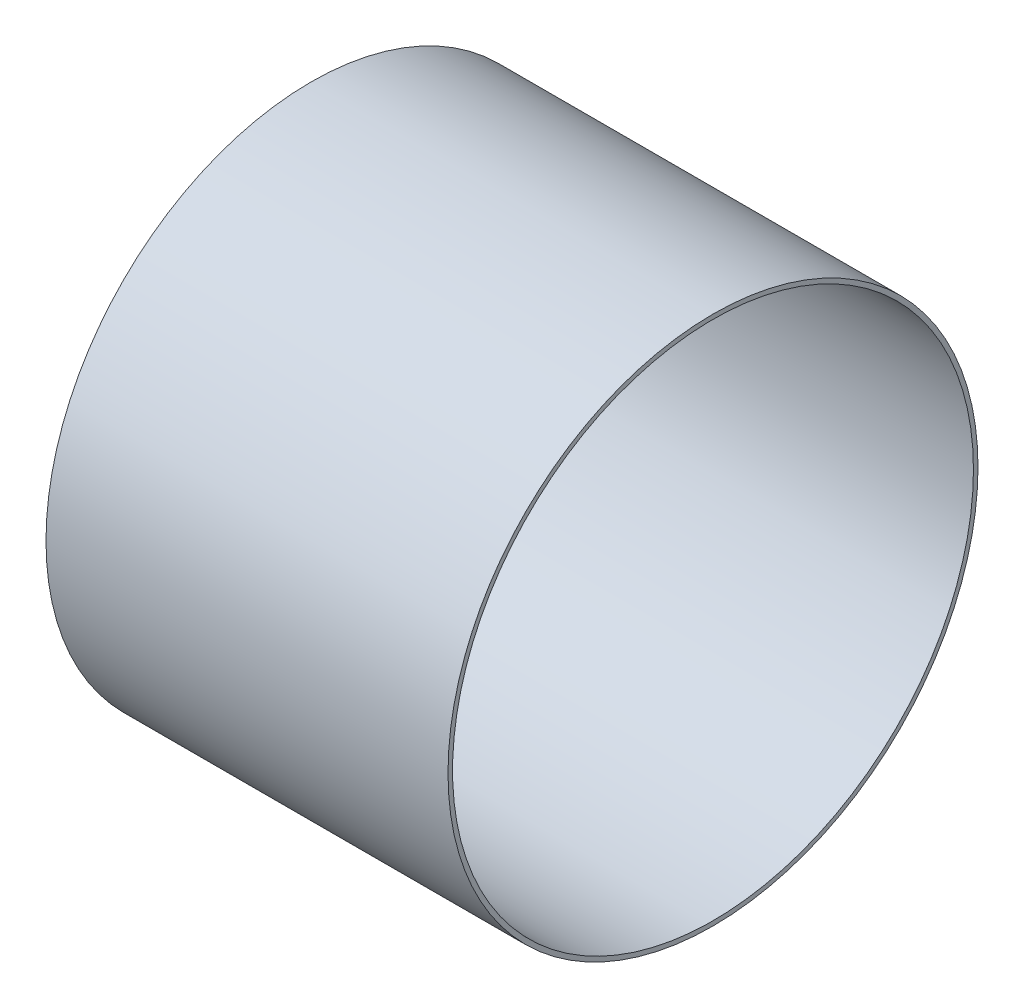
ISO-10303-21;
HEADER;
FILE_DESCRIPTION(('STEP AP214'),'2;1');
FILE_NAME('part.step','',(''),(''),'','','');
FILE_SCHEMA(('AUTOMOTIVE_DESIGN { 1 0 10303 214 1 1 1 1 }'));
ENDSEC;
DATA;
#1=APPLICATION_CONTEXT('core data for automotive mechanical design processes');
#2=APPLICATION_PROTOCOL_DEFINITION('international standard','automotive_design',2000,#1);
#3=PRODUCT_CONTEXT('',#1,'mechanical');
#4=PRODUCT('Part','Part','',(#3));
#5=PRODUCT_RELATED_PRODUCT_CATEGORY('part','',(#4));
#6=PRODUCT_DEFINITION_FORMATION('','',#4);
#7=PRODUCT_DEFINITION_CONTEXT('part definition',#1,'design');
#8=PRODUCT_DEFINITION('design','',#6,#7);
#9=PRODUCT_DEFINITION_SHAPE('','',#8);
#10=(LENGTH_UNIT() NAMED_UNIT(*) SI_UNIT(.MILLI.,.METRE.));
#11=(NAMED_UNIT(*) PLANE_ANGLE_UNIT() SI_UNIT($,.RADIAN.));
#12=(NAMED_UNIT(*) SI_UNIT($,.STERADIAN.) SOLID_ANGLE_UNIT());
#13=UNCERTAINTY_MEASURE_WITH_UNIT(LENGTH_MEASURE(1.E-05),#10,'distance_accuracy_value','');
#14=(GEOMETRIC_REPRESENTATION_CONTEXT(3) GLOBAL_UNCERTAINTY_ASSIGNED_CONTEXT((#13)) GLOBAL_UNIT_ASSIGNED_CONTEXT((#10,
#11,#12)) REPRESENTATION_CONTEXT('',''));
#15=CARTESIAN_POINT('',(0.,0.,0.));
#16=DIRECTION('',(0.,0.,1.));
#17=DIRECTION('',(1.,0.,0.));
#18=AXIS2_PLACEMENT_3D('',#15,#16,#17);
#19=CARTESIAN_POINT('',(74.09688,0.,0.));
#20=DIRECTION('',(1.,0.,0.));
#21=DIRECTION('',(0.,0.,-1.));
#22=AXIS2_PLACEMENT_3D('',#19,#20,#21);
#23=PLANE('',#22);
#24=CARTESIAN_POINT('',(74.09688,0.,0.));
#25=DIRECTION('',(1.,0.,0.));
#26=DIRECTION('',(0.,0.,-1.));
#27=AXIS2_PLACEMENT_3D('',#24,#25,#26);
#28=CIRCLE('',#27,48.8442);
#29=CARTESIAN_POINT('',(74.09688,0.,-48.8442));
#30=VERTEX_POINT('',#29);
#31=EDGE_CURVE('E10',#30,#30,#28,.T.);
#32=ORIENTED_EDGE('',*,*,#31,.T.);
#33=EDGE_LOOP('',(#32));
#34=FACE_BOUND('',#33,.T.);
#35=CARTESIAN_POINT('',(74.09688,0.,0.));
#36=DIRECTION('',(1.,0.,0.));
#37=DIRECTION('',(0.,0.,-1.));
#38=AXIS2_PLACEMENT_3D('',#35,#36,#37);
#39=CIRCLE('',#38,48.006);
#40=CARTESIAN_POINT('',(74.09688,0.,-48.006));
#41=VERTEX_POINT('',#40);
#42=EDGE_CURVE('E46',#41,#41,#39,.T.);
#43=ORIENTED_EDGE('',*,*,#42,.F.);
#44=EDGE_LOOP('',(#43));
#45=FACE_BOUND('',#44,.T.);
#46=ADVANCED_FACE('F35',(#34,#45),#23,.T.);
#47=CARTESIAN_POINT('',(0.,0.,0.));
#48=DIRECTION('',(1.,0.,0.));
#49=DIRECTION('',(0.,0.,-1.));
#50=AXIS2_PLACEMENT_3D('',#47,#48,#49);
#51=PLANE('',#50);
#52=CARTESIAN_POINT('',(0.,0.,0.));
#53=DIRECTION('',(1.,0.,0.));
#54=DIRECTION('',(0.,0.,-1.));
#55=AXIS2_PLACEMENT_3D('',#52,#53,#54);
#56=CIRCLE('',#55,48.8442);
#57=CARTESIAN_POINT('',(0.,0.,-48.8442));
#58=VERTEX_POINT('',#57);
#59=EDGE_CURVE('E39',#58,#58,#56,.T.);
#60=ORIENTED_EDGE('',*,*,#59,.F.);
#61=EDGE_LOOP('',(#60));
#62=FACE_BOUND('',#61,.T.);
#63=CARTESIAN_POINT('',(0.,0.,0.));
#64=DIRECTION('',(1.,0.,0.));
#65=DIRECTION('',(0.,0.,-1.));
#66=AXIS2_PLACEMENT_3D('',#63,#64,#65);
#67=CIRCLE('',#66,48.006);
#68=CARTESIAN_POINT('',(0.,0.,-48.006));
#69=VERTEX_POINT('',#68);
#70=EDGE_CURVE('E48',#69,#69,#67,.T.);
#71=ORIENTED_EDGE('',*,*,#70,.T.);
#72=EDGE_LOOP('',(#71));
#73=FACE_BOUND('',#72,.T.);
#74=ADVANCED_FACE('F58',(#62,#73),#51,.F.);
#75=CARTESIAN_POINT('',(74.09688,0.,0.));
#76=DIRECTION('',(-1.,0.,0.));
#77=DIRECTION('',(0.,0.,1.));
#78=AXIS2_PLACEMENT_3D('',#75,#76,#77);
#79=CYLINDRICAL_SURFACE('',#78,48.8442);
#80=ORIENTED_EDGE('',*,*,#31,.F.);
#81=EDGE_LOOP('',(#80));
#82=FACE_BOUND('',#81,.T.);
#83=ORIENTED_EDGE('',*,*,#59,.T.);
#84=EDGE_LOOP('',(#83));
#85=FACE_BOUND('',#84,.T.);
#86=ADVANCED_FACE('F37',(#82,#85),#79,.T.);
#87=CARTESIAN_POINT('',(74.09688,0.,0.));
#88=DIRECTION('',(-1.,0.,0.));
#89=DIRECTION('',(0.,0.,1.));
#90=AXIS2_PLACEMENT_3D('',#87,#88,#89);
#91=CYLINDRICAL_SURFACE('',#90,48.006);
#92=ORIENTED_EDGE('',*,*,#42,.T.);
#93=EDGE_LOOP('',(#92));
#94=FACE_BOUND('',#93,.T.);
#95=ORIENTED_EDGE('',*,*,#70,.F.);
#96=EDGE_LOOP('',(#95));
#97=FACE_BOUND('',#96,.T.);
#98=ADVANCED_FACE('F54',(#94,#97),#91,.F.);
#99=CLOSED_SHELL('',(#46,#74,#86,#98));
#100=MANIFOLD_SOLID_BREP('B2',#99);
#101=ADVANCED_BREP_SHAPE_REPRESENTATION('',(#18,#100),#14);
#102=SHAPE_DEFINITION_REPRESENTATION(#9,#101);
ENDSEC;
END-ISO-10303-21;
